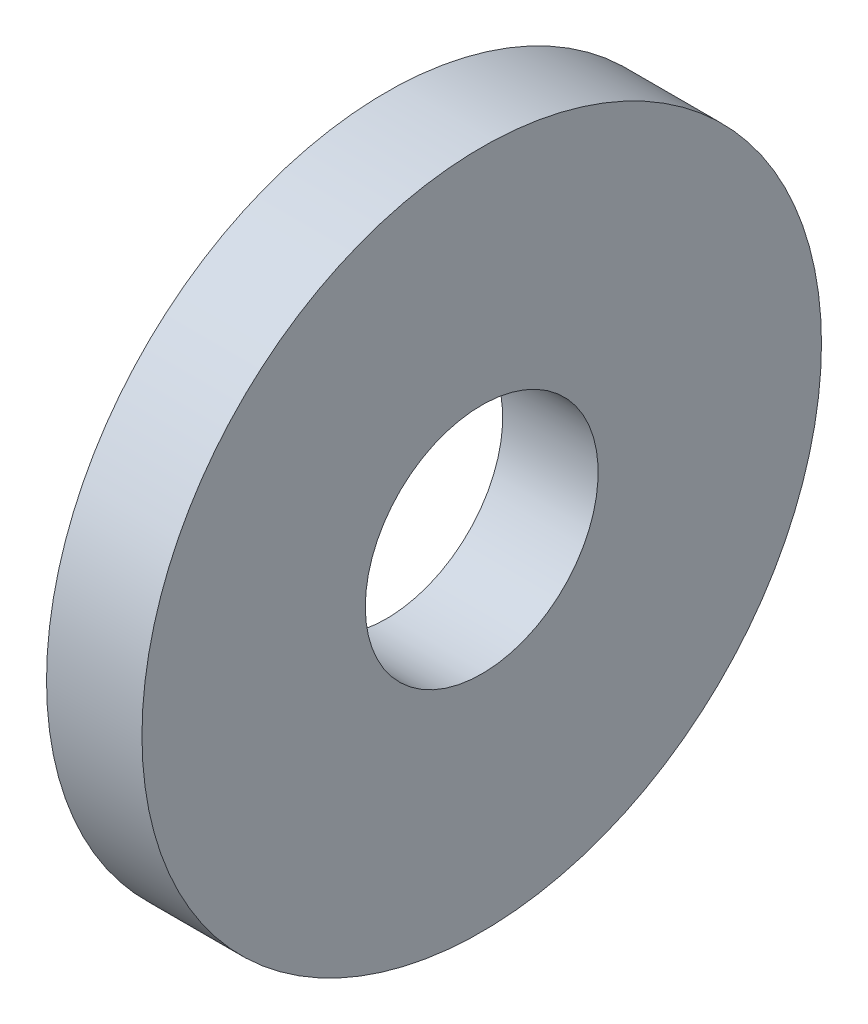
ISO-10303-21;
HEADER;
FILE_DESCRIPTION(('STEP AP214'),'2;1');
FILE_NAME('part.step','',(''),(''),'','','');
FILE_SCHEMA(('AUTOMOTIVE_DESIGN { 1 0 10303 214 1 1 1 1 }'));
ENDSEC;
DATA;
#1=APPLICATION_CONTEXT('core data for automotive mechanical design processes');
#2=APPLICATION_PROTOCOL_DEFINITION('international standard','automotive_design',2000,#1);
#3=PRODUCT_CONTEXT('',#1,'mechanical');
#4=PRODUCT('Part','Part','',(#3));
#5=PRODUCT_RELATED_PRODUCT_CATEGORY('part','',(#4));
#6=PRODUCT_DEFINITION_FORMATION('','',#4);
#7=PRODUCT_DEFINITION_CONTEXT('part definition',#1,'design');
#8=PRODUCT_DEFINITION('design','',#6,#7);
#9=PRODUCT_DEFINITION_SHAPE('','',#8);
#10=(LENGTH_UNIT() NAMED_UNIT(*) SI_UNIT(.MILLI.,.METRE.));
#11=(NAMED_UNIT(*) PLANE_ANGLE_UNIT() SI_UNIT($,.RADIAN.));
#12=(NAMED_UNIT(*) SI_UNIT($,.STERADIAN.) SOLID_ANGLE_UNIT());
#13=UNCERTAINTY_MEASURE_WITH_UNIT(LENGTH_MEASURE(1.E-05),#10,'distance_accuracy_value','');
#14=(GEOMETRIC_REPRESENTATION_CONTEXT(3) GLOBAL_UNCERTAINTY_ASSIGNED_CONTEXT((#13)) GLOBAL_UNIT_ASSIGNED_CONTEXT((#10,
#11,#12)) REPRESENTATION_CONTEXT('',''));
#15=CARTESIAN_POINT('',(0.,0.,0.));
#16=DIRECTION('',(0.,0.,1.));
#17=DIRECTION('',(1.,0.,0.));
#18=AXIS2_PLACEMENT_3D('',#15,#16,#17);
#19=CARTESIAN_POINT('',(-10.,0.,0.));
#20=DIRECTION('',(-1.,0.,0.));
#21=DIRECTION('',(0.,0.,1.));
#22=AXIS2_PLACEMENT_3D('',#19,#20,#21);
#23=CYLINDRICAL_SURFACE('',#22,3.05);
#24=CARTESIAN_POINT('',(0.,0.,0.));
#25=DIRECTION('',(-1.,0.,0.));
#26=DIRECTION('',(0.,0.,1.));
#27=AXIS2_PLACEMENT_3D('',#24,#25,#26);
#28=CIRCLE('',#27,3.05);
#29=CARTESIAN_POINT('',(0.,0.,3.05));
#30=VERTEX_POINT('',#29);
#31=EDGE_CURVE('E10',#30,#30,#28,.T.);
#32=ORIENTED_EDGE('',*,*,#31,.F.);
#33=EDGE_LOOP('',(#32));
#34=FACE_BOUND('',#33,.T.);
#35=CARTESIAN_POINT('',(-2.5,0.,0.));
#36=DIRECTION('',(-1.,0.,0.));
#37=DIRECTION('',(0.,0.,1.));
#38=AXIS2_PLACEMENT_3D('',#35,#36,#37);
#39=CIRCLE('',#38,3.05);
#40=CARTESIAN_POINT('',(-2.5,0.,3.05));
#41=VERTEX_POINT('',#40);
#42=EDGE_CURVE('E51',#41,#41,#39,.T.);
#43=ORIENTED_EDGE('',*,*,#42,.T.);
#44=EDGE_LOOP('',(#43));
#45=FACE_BOUND('',#44,.T.);
#46=ADVANCED_FACE('F37',(#34,#45),#23,.F.);
#47=CARTESIAN_POINT('',(0.,3.05,0.));
#48=DIRECTION('',(-1.,0.,0.));
#49=DIRECTION('',(0.,0.,1.));
#50=AXIS2_PLACEMENT_3D('',#47,#48,#49);
#51=PLANE('',#50);
#52=CARTESIAN_POINT('',(0.,0.,0.));
#53=DIRECTION('',(-1.,0.,0.));
#54=DIRECTION('',(0.,0.,1.));
#55=AXIS2_PLACEMENT_3D('',#52,#53,#54);
#56=CIRCLE('',#55,8.9);
#57=CARTESIAN_POINT('',(0.,0.,8.9));
#58=VERTEX_POINT('',#57);
#59=EDGE_CURVE('E43',#58,#58,#56,.T.);
#60=ORIENTED_EDGE('',*,*,#59,.F.);
#61=EDGE_LOOP('',(#60));
#62=FACE_BOUND('',#61,.T.);
#63=ORIENTED_EDGE('',*,*,#31,.T.);
#64=EDGE_LOOP('',(#63));
#65=FACE_BOUND('',#64,.T.);
#66=ADVANCED_FACE('F66',(#62,#65),#51,.F.);
#67=CARTESIAN_POINT('',(-10.,0.,0.));
#68=DIRECTION('',(-1.,0.,0.));
#69=DIRECTION('',(0.,0.,1.));
#70=AXIS2_PLACEMENT_3D('',#67,#68,#69);
#71=CYLINDRICAL_SURFACE('',#70,8.9);
#72=CARTESIAN_POINT('',(-2.5,0.,0.));
#73=DIRECTION('',(-1.,0.,0.));
#74=DIRECTION('',(0.,0.,1.));
#75=AXIS2_PLACEMENT_3D('',#72,#73,#74);
#76=CIRCLE('',#75,8.9);
#77=CARTESIAN_POINT('',(-2.5,0.,8.9));
#78=VERTEX_POINT('',#77);
#79=EDGE_CURVE('E47',#78,#78,#76,.T.);
#80=ORIENTED_EDGE('',*,*,#79,.F.);
#81=EDGE_LOOP('',(#80));
#82=FACE_BOUND('',#81,.T.);
#83=ORIENTED_EDGE('',*,*,#59,.T.);
#84=EDGE_LOOP('',(#83));
#85=FACE_BOUND('',#84,.T.);
#86=ADVANCED_FACE('F61',(#82,#85),#71,.T.);
#87=CARTESIAN_POINT('',(-2.5,8.9,0.));
#88=DIRECTION('',(1.,0.,0.));
#89=DIRECTION('',(0.,0.,-1.));
#90=AXIS2_PLACEMENT_3D('',#87,#88,#89);
#91=PLANE('',#90);
#92=ORIENTED_EDGE('',*,*,#42,.F.);
#93=EDGE_LOOP('',(#92));
#94=FACE_BOUND('',#93,.T.);
#95=ORIENTED_EDGE('',*,*,#79,.T.);
#96=EDGE_LOOP('',(#95));
#97=FACE_BOUND('',#96,.T.);
#98=ADVANCED_FACE('F58',(#94,#97),#91,.F.);
#99=CLOSED_SHELL('',(#46,#66,#86,#98));
#100=MANIFOLD_SOLID_BREP('B2',#99);
#101=ADVANCED_BREP_SHAPE_REPRESENTATION('',(#18,#100),#14);
#102=SHAPE_DEFINITION_REPRESENTATION(#9,#101);
ENDSEC;
END-ISO-10303-21;
